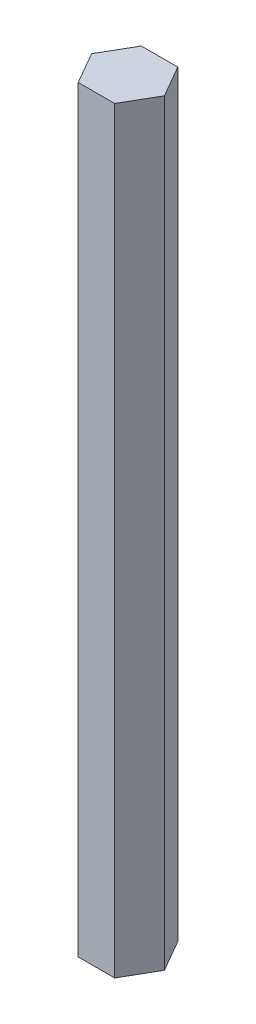
ISO-10303-21;
HEADER;
FILE_DESCRIPTION(('STEP AP214'),'2;1');
FILE_NAME('part.step','',(''),(''),'','','');
FILE_SCHEMA(('AUTOMOTIVE_DESIGN { 1 0 10303 214 1 1 1 1 }'));
ENDSEC;
DATA;
#1=APPLICATION_CONTEXT('core data for automotive mechanical design processes');
#2=APPLICATION_PROTOCOL_DEFINITION('international standard','automotive_design',2000,#1);
#3=PRODUCT_CONTEXT('',#1,'mechanical');
#4=PRODUCT('Part','Part','',(#3));
#5=PRODUCT_RELATED_PRODUCT_CATEGORY('part','',(#4));
#6=PRODUCT_DEFINITION_FORMATION('','',#4);
#7=PRODUCT_DEFINITION_CONTEXT('part definition',#1,'design');
#8=PRODUCT_DEFINITION('design','',#6,#7);
#9=PRODUCT_DEFINITION_SHAPE('','',#8);
#10=(LENGTH_UNIT() NAMED_UNIT(*) SI_UNIT(.MILLI.,.METRE.));
#11=(NAMED_UNIT(*) PLANE_ANGLE_UNIT() SI_UNIT($,.RADIAN.));
#12=(NAMED_UNIT(*) SI_UNIT($,.STERADIAN.) SOLID_ANGLE_UNIT());
#13=UNCERTAINTY_MEASURE_WITH_UNIT(LENGTH_MEASURE(1.E-05),#10,'distance_accuracy_value','');
#14=(GEOMETRIC_REPRESENTATION_CONTEXT(3) GLOBAL_UNCERTAINTY_ASSIGNED_CONTEXT((#13)) GLOBAL_UNIT_ASSIGNED_CONTEXT((#10,
#11,#12)) REPRESENTATION_CONTEXT('',''));
#15=CARTESIAN_POINT('',(0.,0.,0.));
#16=DIRECTION('',(0.,0.,1.));
#17=DIRECTION('',(1.,0.,0.));
#18=AXIS2_PLACEMENT_3D('',#15,#16,#17);
#19=CARTESIAN_POINT('',(3.6661742093542,152.4,6.34999999999996));
#20=DIRECTION('',(-0.866025403784442,0.,-0.499999999999995));
#21=DIRECTION('',(-0.499999999999995,0.,0.866025403784442));
#22=AXIS2_PLACEMENT_3D('',#19,#20,#21);
#23=PLANE('',#22);
#24=DIRECTION('',(0.499999999999995,0.,-0.866025403784441));
#25=VECTOR('',#24,1.);
#26=CARTESIAN_POINT('',(3.6661742093542,0.,6.34999999999996));
#27=LINE('',#26,#25);
#28=CARTESIAN_POINT('',(3.6661742093542,0.,6.34999999999996));
#29=VERTEX_POINT('',#28);
#30=CARTESIAN_POINT('',(7.33234841870825,0.,0.));
#31=VERTEX_POINT('',#30);
#32=EDGE_CURVE('E121',#29,#31,#27,.T.);
#33=ORIENTED_EDGE('',*,*,#32,.T.);
#34=DIRECTION('',(0.,-1.,0.));
#35=VECTOR('',#34,1.);
#36=CARTESIAN_POINT('',(7.33234841870825,152.4,0.));
#37=LINE('',#36,#35);
#38=CARTESIAN_POINT('',(7.33234841870825,152.4,0.));
#39=VERTEX_POINT('',#38);
#40=EDGE_CURVE('E11',#39,#31,#37,.T.);
#41=ORIENTED_EDGE('',*,*,#40,.F.);
#42=DIRECTION('',(0.499999999999995,0.,-0.866025403784441));
#43=VECTOR('',#42,1.);
#44=CARTESIAN_POINT('',(3.6661742093542,152.4,6.34999999999996));
#45=LINE('',#44,#43);
#46=CARTESIAN_POINT('',(3.6661742093542,152.4,6.34999999999996));
#47=VERTEX_POINT('',#46);
#48=EDGE_CURVE('E131',#47,#39,#45,.T.);
#49=ORIENTED_EDGE('',*,*,#48,.F.);
#50=DIRECTION('',(0.,-1.,0.));
#51=VECTOR('',#50,1.);
#52=CARTESIAN_POINT('',(3.6661742093542,152.4,6.34999999999996));
#53=LINE('',#52,#51);
#54=EDGE_CURVE('E117',#47,#29,#53,.T.);
#55=ORIENTED_EDGE('',*,*,#54,.T.);
#56=EDGE_LOOP('',(#33,#41,#49,#55));
#57=FACE_BOUND('',#56,.T.);
#58=ADVANCED_FACE('F37',(#57),#23,.F.);
#59=CARTESIAN_POINT('',(7.33234841870825,152.4,0.));
#60=DIRECTION('',(-0.866025403784438,0.,0.500000000000001));
#61=DIRECTION('',(0.500000000000001,0.,0.866025403784438));
#62=AXIS2_PLACEMENT_3D('',#59,#60,#61);
#63=PLANE('',#62);
#64=DIRECTION('',(-0.500000000000001,0.,-0.866025403784438));
#65=VECTOR('',#64,1.);
#66=CARTESIAN_POINT('',(7.33234841870825,0.,0.));
#67=LINE('',#66,#65);
#68=CARTESIAN_POINT('',(3.66617420935411,0.,-6.35000000000001));
#69=VERTEX_POINT('',#68);
#70=EDGE_CURVE('E124',#31,#69,#67,.T.);
#71=ORIENTED_EDGE('',*,*,#70,.T.);
#72=DIRECTION('',(0.,-1.,0.));
#73=VECTOR('',#72,1.);
#74=CARTESIAN_POINT('',(3.66617420935411,152.4,-6.35000000000001));
#75=LINE('',#74,#73);
#76=CARTESIAN_POINT('',(3.66617420935411,152.4,-6.35000000000001));
#77=VERTEX_POINT('',#76);
#78=EDGE_CURVE('E45',#77,#69,#75,.T.);
#79=ORIENTED_EDGE('',*,*,#78,.F.);
#80=DIRECTION('',(-0.500000000000001,0.,-0.866025403784438));
#81=VECTOR('',#80,1.);
#82=CARTESIAN_POINT('',(7.33234841870825,152.4,0.));
#83=LINE('',#82,#81);
#84=EDGE_CURVE('E90',#39,#77,#83,.T.);
#85=ORIENTED_EDGE('',*,*,#84,.F.);
#86=ORIENTED_EDGE('',*,*,#40,.T.);
#87=EDGE_LOOP('',(#71,#79,#85,#86));
#88=FACE_BOUND('',#87,.T.);
#89=ADVANCED_FACE('F155',(#88),#63,.F.);
#90=CARTESIAN_POINT('',(3.66617420935411,152.4,-6.35000000000001));
#91=DIRECTION('',(0.,0.,1.));
#92=DIRECTION('',(1.,0.,0.));
#93=AXIS2_PLACEMENT_3D('',#90,#91,#92);
#94=PLANE('',#93);
#95=DIRECTION('',(-1.,0.,0.));
#96=VECTOR('',#95,1.);
#97=CARTESIAN_POINT('',(3.66617420935411,0.,-6.35000000000001));
#98=LINE('',#97,#96);
#99=CARTESIAN_POINT('',(-3.66617420935416,0.,-6.34999999999999));
#100=VERTEX_POINT('',#99);
#101=EDGE_CURVE('E126',#69,#100,#98,.T.);
#102=ORIENTED_EDGE('',*,*,#101,.T.);
#103=DIRECTION('',(0.,-1.,0.));
#104=VECTOR('',#103,1.);
#105=CARTESIAN_POINT('',(-3.66617420935416,152.4,-6.34999999999999));
#106=LINE('',#105,#104);
#107=CARTESIAN_POINT('',(-3.66617420935416,152.4,-6.34999999999999));
#108=VERTEX_POINT('',#107);
#109=EDGE_CURVE('E112',#108,#100,#106,.T.);
#110=ORIENTED_EDGE('',*,*,#109,.F.);
#111=DIRECTION('',(-1.,0.,0.));
#112=VECTOR('',#111,1.);
#113=CARTESIAN_POINT('',(3.66617420935411,152.4,-6.35000000000001));
#114=LINE('',#113,#112);
#115=EDGE_CURVE('E103',#77,#108,#114,.T.);
#116=ORIENTED_EDGE('',*,*,#115,.F.);
#117=ORIENTED_EDGE('',*,*,#78,.T.);
#118=EDGE_LOOP('',(#102,#110,#116,#117));
#119=FACE_BOUND('',#118,.T.);
#120=ADVANCED_FACE('F137',(#119),#94,.F.);
#121=CARTESIAN_POINT('',(-3.66617420935416,152.4,-6.34999999999999));
#122=DIRECTION('',(0.866025403784442,0.,0.499999999999995));
#123=DIRECTION('',(0.499999999999995,0.,-0.866025403784442));
#124=AXIS2_PLACEMENT_3D('',#121,#122,#123);
#125=PLANE('',#124);
#126=DIRECTION('',(-0.499999999999995,0.,0.866025403784441));
#127=VECTOR('',#126,1.);
#128=CARTESIAN_POINT('',(-3.66617420935416,0.,-6.34999999999999));
#129=LINE('',#128,#127);
#130=CARTESIAN_POINT('',(-7.33234841870825,0.,0.));
#131=VERTEX_POINT('',#130);
#132=EDGE_CURVE('E111',#100,#131,#129,.T.);
#133=ORIENTED_EDGE('',*,*,#132,.T.);
#134=DIRECTION('',(0.,-1.,0.));
#135=VECTOR('',#134,1.);
#136=CARTESIAN_POINT('',(-7.33234841870825,152.4,0.));
#137=LINE('',#136,#135);
#138=CARTESIAN_POINT('',(-7.33234841870825,152.4,0.));
#139=VERTEX_POINT('',#138);
#140=EDGE_CURVE('E108',#139,#131,#137,.T.);
#141=ORIENTED_EDGE('',*,*,#140,.F.);
#142=DIRECTION('',(-0.499999999999995,0.,0.866025403784441));
#143=VECTOR('',#142,1.);
#144=CARTESIAN_POINT('',(-3.66617420935416,152.4,-6.34999999999999));
#145=LINE('',#144,#143);
#146=EDGE_CURVE('E97',#108,#139,#145,.T.);
#147=ORIENTED_EDGE('',*,*,#146,.F.);
#148=ORIENTED_EDGE('',*,*,#109,.T.);
#149=EDGE_LOOP('',(#133,#141,#147,#148));
#150=FACE_BOUND('',#149,.T.);
#151=ADVANCED_FACE('F109',(#150),#125,.F.);
#152=CARTESIAN_POINT('',(-7.33234841870825,152.4,0.));
#153=DIRECTION('',(0.866025403784435,0.,-0.500000000000007));
#154=DIRECTION('',(-0.500000000000007,0.,-0.866025403784435));
#155=AXIS2_PLACEMENT_3D('',#152,#153,#154);
#156=PLANE('',#155);
#157=DIRECTION('',(0.500000000000007,0.,0.866025403784435));
#158=VECTOR('',#157,1.);
#159=CARTESIAN_POINT('',(-7.33234841870825,0.,0.));
#160=LINE('',#159,#158);
#161=CARTESIAN_POINT('',(-3.66617420935407,0.,6.35000000000004));
#162=VERTEX_POINT('',#161);
#163=EDGE_CURVE('E76',#131,#162,#160,.T.);
#164=ORIENTED_EDGE('',*,*,#163,.T.);
#165=DIRECTION('',(0.,-1.,0.));
#166=VECTOR('',#165,1.);
#167=CARTESIAN_POINT('',(-3.66617420935407,152.4,6.35000000000004));
#168=LINE('',#167,#166);
#169=CARTESIAN_POINT('',(-3.66617420935407,152.4,6.35000000000004));
#170=VERTEX_POINT('',#169);
#171=EDGE_CURVE('E113',#170,#162,#168,.T.);
#172=ORIENTED_EDGE('',*,*,#171,.F.);
#173=DIRECTION('',(0.500000000000007,0.,0.866025403784435));
#174=VECTOR('',#173,1.);
#175=CARTESIAN_POINT('',(-7.33234841870825,152.4,0.));
#176=LINE('',#175,#174);
#177=EDGE_CURVE('E101',#139,#170,#176,.T.);
#178=ORIENTED_EDGE('',*,*,#177,.F.);
#179=ORIENTED_EDGE('',*,*,#140,.T.);
#180=EDGE_LOOP('',(#164,#172,#178,#179));
#181=FACE_BOUND('',#180,.T.);
#182=ADVANCED_FACE('F115',(#181),#156,.F.);
#183=CARTESIAN_POINT('',(-3.66617420935407,152.4,6.35000000000004));
#184=DIRECTION('',(0.,0.,-1.));
#185=DIRECTION('',(-1.,0.,0.));
#186=AXIS2_PLACEMENT_3D('',#183,#184,#185);
#187=PLANE('',#186);
#188=DIRECTION('',(1.,0.,0.));
#189=VECTOR('',#188,1.);
#190=CARTESIAN_POINT('',(-3.66617420935407,0.,6.35000000000004));
#191=LINE('',#190,#189);
#192=EDGE_CURVE('E82',#162,#29,#191,.T.);
#193=ORIENTED_EDGE('',*,*,#192,.T.);
#194=ORIENTED_EDGE('',*,*,#54,.F.);
#195=DIRECTION('',(1.,0.,0.));
#196=VECTOR('',#195,1.);
#197=CARTESIAN_POINT('',(-3.66617420935407,152.4,6.35000000000004));
#198=LINE('',#197,#196);
#199=EDGE_CURVE('E53',#170,#47,#198,.T.);
#200=ORIENTED_EDGE('',*,*,#199,.F.);
#201=ORIENTED_EDGE('',*,*,#171,.T.);
#202=EDGE_LOOP('',(#193,#194,#200,#201));
#203=FACE_BOUND('',#202,.T.);
#204=ADVANCED_FACE('F144',(#203),#187,.F.);
#205=CARTESIAN_POINT('',(0.,152.4,0.));
#206=DIRECTION('',(0.,1.,0.));
#207=DIRECTION('',(0.,0.,1.));
#208=AXIS2_PLACEMENT_3D('',#205,#206,#207);
#209=PLANE('',#208);
#210=ORIENTED_EDGE('',*,*,#48,.T.);
#211=ORIENTED_EDGE('',*,*,#84,.T.);
#212=ORIENTED_EDGE('',*,*,#115,.T.);
#213=ORIENTED_EDGE('',*,*,#146,.T.);
#214=ORIENTED_EDGE('',*,*,#177,.T.);
#215=ORIENTED_EDGE('',*,*,#199,.T.);
#216=EDGE_LOOP('',(#210,#211,#212,#213,#214,#215));
#217=FACE_BOUND('',#216,.T.);
#218=ADVANCED_FACE('F99',(#217),#209,.T.);
#219=CARTESIAN_POINT('',(0.,0.,0.));
#220=DIRECTION('',(0.,1.,0.));
#221=DIRECTION('',(0.,0.,1.));
#222=AXIS2_PLACEMENT_3D('',#219,#220,#221);
#223=PLANE('',#222);
#224=ORIENTED_EDGE('',*,*,#32,.F.);
#225=ORIENTED_EDGE('',*,*,#192,.F.);
#226=ORIENTED_EDGE('',*,*,#163,.F.);
#227=ORIENTED_EDGE('',*,*,#132,.F.);
#228=ORIENTED_EDGE('',*,*,#101,.F.);
#229=ORIENTED_EDGE('',*,*,#70,.F.);
#230=EDGE_LOOP('',(#224,#225,#226,#227,#228,#229));
#231=FACE_BOUND('',#230,.T.);
#232=ADVANCED_FACE('F140',(#231),#223,.F.);
#233=CLOSED_SHELL('',(#58,#89,#120,#151,#182,#204,#218,#232));
#234=MANIFOLD_SOLID_BREP('B2',#233);
#235=ADVANCED_BREP_SHAPE_REPRESENTATION('',(#18,#234),#14);
#236=SHAPE_DEFINITION_REPRESENTATION(#9,#235);
ENDSEC;
END-ISO-10303-21;
